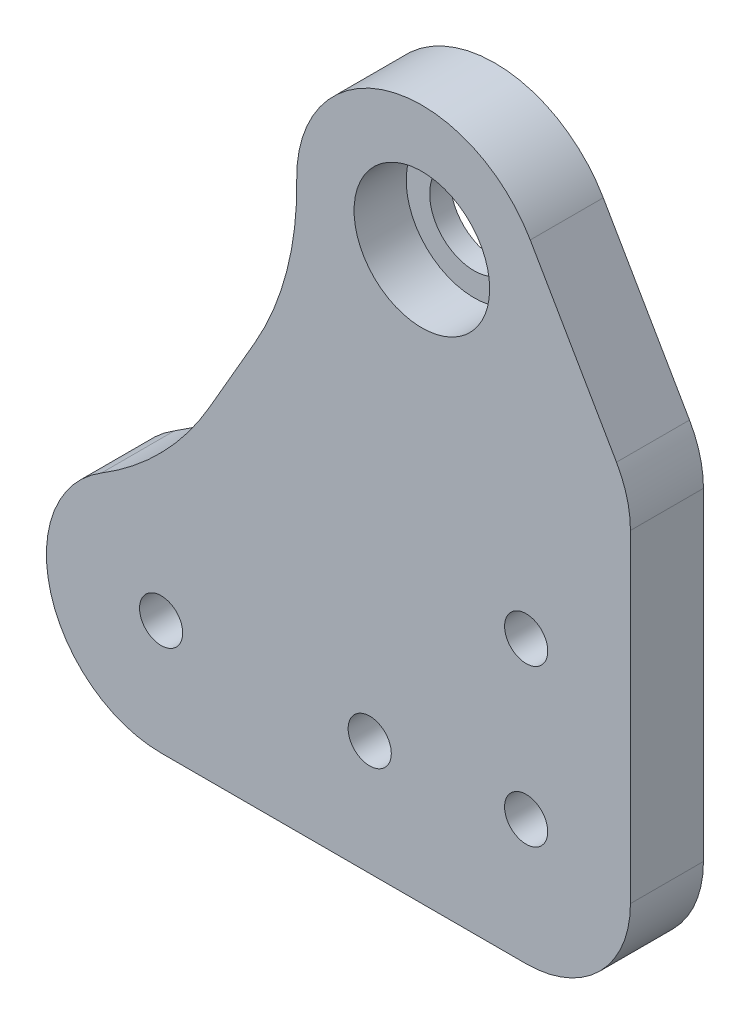
ISO-10303-21;
HEADER;
FILE_DESCRIPTION(('STEP AP214'),'2;1');
FILE_NAME('part.step','',(''),(''),'','','');
FILE_SCHEMA(('AUTOMOTIVE_DESIGN { 1 0 10303 214 1 1 1 1 }'));
ENDSEC;
DATA;
#1=APPLICATION_CONTEXT('core data for automotive mechanical design processes');
#2=APPLICATION_PROTOCOL_DEFINITION('international standard','automotive_design',2000,#1);
#3=PRODUCT_CONTEXT('',#1,'mechanical');
#4=PRODUCT('Part','Part','',(#3));
#5=PRODUCT_RELATED_PRODUCT_CATEGORY('part','',(#4));
#6=PRODUCT_DEFINITION_FORMATION('','',#4);
#7=PRODUCT_DEFINITION_CONTEXT('part definition',#1,'design');
#8=PRODUCT_DEFINITION('design','',#6,#7);
#9=PRODUCT_DEFINITION_SHAPE('','',#8);
#10=(LENGTH_UNIT() NAMED_UNIT(*) SI_UNIT(.MILLI.,.METRE.));
#11=(NAMED_UNIT(*) PLANE_ANGLE_UNIT() SI_UNIT($,.RADIAN.));
#12=(NAMED_UNIT(*) SI_UNIT($,.STERADIAN.) SOLID_ANGLE_UNIT());
#13=UNCERTAINTY_MEASURE_WITH_UNIT(LENGTH_MEASURE(1.E-05),#10,'distance_accuracy_value','');
#14=(GEOMETRIC_REPRESENTATION_CONTEXT(3) GLOBAL_UNCERTAINTY_ASSIGNED_CONTEXT((#13)) GLOBAL_UNIT_ASSIGNED_CONTEXT((#10,
#11,#12)) REPRESENTATION_CONTEXT('',''));
#15=CARTESIAN_POINT('',(0.,0.,0.));
#16=DIRECTION('',(0.,0.,1.));
#17=DIRECTION('',(1.,0.,0.));
#18=AXIS2_PLACEMENT_3D('',#15,#16,#17);
#19=CARTESIAN_POINT('',(25.000000000011,43.3012701892403,7.));
#20=DIRECTION('',(0.,0.,-1.));
#21=DIRECTION('',(-1.,0.,0.));
#22=AXIS2_PLACEMENT_3D('',#19,#20,#21);
#23=CYLINDRICAL_SURFACE('',#22,4.25000000000053);
#24=CARTESIAN_POINT('',(25.000000000011,43.3012701892403,0.));
#25=DIRECTION('',(0.,0.,1.));
#26=DIRECTION('',(1.,0.,0.));
#27=AXIS2_PLACEMENT_3D('',#24,#25,#26);
#28=CIRCLE('',#27,4.25000000000053);
#29=CARTESIAN_POINT('',(29.2500000000115,43.3012701892403,0.));
#30=VERTEX_POINT('',#29);
#31=EDGE_CURVE('E196',#30,#30,#28,.T.);
#32=ORIENTED_EDGE('',*,*,#31,.F.);
#33=EDGE_LOOP('',(#32));
#34=FACE_BOUND('',#33,.T.);
#35=CARTESIAN_POINT('',(25.000000000011,43.3012701892403,2.));
#36=DIRECTION('',(0.,0.,1.));
#37=DIRECTION('',(1.,0.,0.));
#38=AXIS2_PLACEMENT_3D('',#35,#36,#37);
#39=CIRCLE('',#38,4.25000000000053);
#40=CARTESIAN_POINT('',(29.2500000000115,43.3012701892403,2.));
#41=VERTEX_POINT('',#40);
#42=EDGE_CURVE('E38',#41,#41,#39,.T.);
#43=ORIENTED_EDGE('',*,*,#42,.T.);
#44=EDGE_LOOP('',(#43));
#45=FACE_BOUND('',#44,.T.);
#46=ADVANCED_FACE('F34',(#34,#45),#23,.F.);
#47=CARTESIAN_POINT('',(45.0000000000006,0.,7.));
#48=DIRECTION('',(1.,0.,0.));
#49=DIRECTION('',(0.,0.,-1.));
#50=AXIS2_PLACEMENT_3D('',#47,#48,#49);
#51=PLANE('',#50);
#52=DIRECTION('',(0.,-1.,0.));
#53=VECTOR('',#52,1.);
#54=CARTESIAN_POINT('',(45.0000000000006,0.,0.));
#55=LINE('',#54,#53);
#56=CARTESIAN_POINT('',(45.0000000000006,29.9807621135728,0.));
#57=VERTEX_POINT('',#56);
#58=CARTESIAN_POINT('',(45.0000000000006,-1.00000000000033,0.));
#59=VERTEX_POINT('',#58);
#60=EDGE_CURVE('E168',#57,#59,#55,.T.);
#61=ORIENTED_EDGE('',*,*,#60,.F.);
#62=DIRECTION('',(0.,0.,-1.));
#63=VECTOR('',#62,1.);
#64=CARTESIAN_POINT('',(45.0000000000006,29.9807621135728,7.));
#65=LINE('',#64,#63);
#66=CARTESIAN_POINT('',(45.0000000000006,29.9807621135728,7.));
#67=VERTEX_POINT('',#66);
#68=EDGE_CURVE('E11',#67,#57,#65,.T.);
#69=ORIENTED_EDGE('',*,*,#68,.F.);
#70=DIRECTION('',(0.,-1.,0.));
#71=VECTOR('',#70,1.);
#72=CARTESIAN_POINT('',(45.0000000000006,0.,7.));
#73=LINE('',#72,#71);
#74=CARTESIAN_POINT('',(45.0000000000006,-1.00000000000033,7.));
#75=VERTEX_POINT('',#74);
#76=EDGE_CURVE('E251',#67,#75,#73,.T.);
#77=ORIENTED_EDGE('',*,*,#76,.T.);
#78=DIRECTION('',(0.,0.,-1.));
#79=VECTOR('',#78,1.);
#80=CARTESIAN_POINT('',(45.0000000000006,-1.00000000000033,7.));
#81=LINE('',#80,#79);
#82=EDGE_CURVE('E92',#75,#59,#81,.T.);
#83=ORIENTED_EDGE('',*,*,#82,.T.);
#84=EDGE_LOOP('',(#61,#69,#77,#83));
#85=FACE_BOUND('',#84,.T.);
#86=ADVANCED_FACE('F221',(#85),#51,.T.);
#87=CARTESIAN_POINT('',(34.9999999999986,29.9807621135728,7.));
#88=DIRECTION('',(0.,0.,-1.));
#89=DIRECTION('',(-1.,0.,0.));
#90=AXIS2_PLACEMENT_3D('',#87,#88,#89);
#91=CYLINDRICAL_SURFACE('',#90,10.0000000000019);
#92=CARTESIAN_POINT('',(34.9999999999986,29.9807621135728,0.));
#93=DIRECTION('',(0.,0.,1.));
#94=DIRECTION('',(1.,0.,0.));
#95=AXIS2_PLACEMENT_3D('',#92,#93,#94);
#96=CIRCLE('',#95,10.0000000000019);
#97=CARTESIAN_POINT('',(43.6602540378446,34.9807621135736,0.));
#98=VERTEX_POINT('',#97);
#99=EDGE_CURVE('E166',#57,#98,#96,.T.);
#100=ORIENTED_EDGE('',*,*,#99,.T.);
#101=DIRECTION('',(0.,0.,-1.));
#102=VECTOR('',#101,1.);
#103=CARTESIAN_POINT('',(43.6602540378446,34.9807621135736,7.));
#104=LINE('',#103,#102);
#105=CARTESIAN_POINT('',(43.6602540378446,34.9807621135736,7.));
#106=VERTEX_POINT('',#105);
#107=EDGE_CURVE('E44',#106,#98,#104,.T.);
#108=ORIENTED_EDGE('',*,*,#107,.F.);
#109=CARTESIAN_POINT('',(34.9999999999986,29.9807621135728,7.));
#110=DIRECTION('',(0.,0.,1.));
#111=DIRECTION('',(1.,0.,0.));
#112=AXIS2_PLACEMENT_3D('',#109,#110,#111);
#113=CIRCLE('',#112,10.0000000000019);
#114=EDGE_CURVE('E253',#67,#106,#113,.T.);
#115=ORIENTED_EDGE('',*,*,#114,.F.);
#116=ORIENTED_EDGE('',*,*,#68,.T.);
#117=EDGE_LOOP('',(#100,#108,#115,#116));
#118=FACE_BOUND('',#117,.T.);
#119=ADVANCED_FACE('F167',(#118),#91,.T.);
#120=CARTESIAN_POINT('',(47.8923048454286,27.650635094627,7.));
#121=DIRECTION('',(-0.866025403784382,-0.500000000000097,0.));
#122=DIRECTION('',(0.500000000000097,-0.866025403784383,0.));
#123=AXIS2_PLACEMENT_3D('',#120,#121,#122);
#124=PLANE('',#123);
#125=DIRECTION('',(-0.500000000000097,0.866025403784382,0.));
#126=VECTOR('',#125,1.);
#127=CARTESIAN_POINT('',(47.8923048454286,27.650635094627,0.));
#128=LINE('',#127,#126);
#129=CARTESIAN_POINT('',(35.3923048454239,49.3012701892406,0.));
#130=VERTEX_POINT('',#129);
#131=EDGE_CURVE('E160',#98,#130,#128,.T.);
#132=ORIENTED_EDGE('',*,*,#131,.T.);
#133=DIRECTION('',(0.,0.,-1.));
#134=VECTOR('',#133,1.);
#135=CARTESIAN_POINT('',(35.3923048454239,49.3012701892406,7.));
#136=LINE('',#135,#134);
#137=CARTESIAN_POINT('',(35.3923048454239,49.3012701892406,7.));
#138=VERTEX_POINT('',#137);
#139=EDGE_CURVE('E150',#138,#130,#136,.T.);
#140=ORIENTED_EDGE('',*,*,#139,.F.);
#141=DIRECTION('',(-0.500000000000097,0.866025403784382,0.));
#142=VECTOR('',#141,1.);
#143=CARTESIAN_POINT('',(47.8923048454286,27.650635094627,7.));
#144=LINE('',#143,#142);
#145=EDGE_CURVE('E162',#106,#138,#144,.T.);
#146=ORIENTED_EDGE('',*,*,#145,.F.);
#147=ORIENTED_EDGE('',*,*,#107,.T.);
#148=EDGE_LOOP('',(#132,#140,#146,#147));
#149=FACE_BOUND('',#148,.T.);
#150=ADVANCED_FACE('F158',(#149),#124,.F.);
#151=CARTESIAN_POINT('',(25.000000000011,43.3012701892403,7.));
#152=DIRECTION('',(0.,0.,-1.));
#153=DIRECTION('',(-1.,0.,0.));
#154=AXIS2_PLACEMENT_3D('',#151,#152,#153);
#155=CYLINDRICAL_SURFACE('',#154,11.9999999999999);
#156=CARTESIAN_POINT('',(25.000000000011,43.3012701892403,0.));
#157=DIRECTION('',(0.,0.,1.));
#158=DIRECTION('',(1.,0.,0.));
#159=AXIS2_PLACEMENT_3D('',#156,#157,#158);
#160=CIRCLE('',#159,11.9999999999999);
#161=CARTESIAN_POINT('',(13.0018376106876,43.0912719049008,0.));
#162=VERTEX_POINT('',#161);
#163=EDGE_CURVE('E170',#130,#162,#160,.T.);
#164=ORIENTED_EDGE('',*,*,#163,.T.);
#165=DIRECTION('',(0.,0.,-1.));
#166=VECTOR('',#165,1.);
#167=CARTESIAN_POINT('',(13.0018376106876,43.0912719049008,7.));
#168=LINE('',#167,#166);
#169=CARTESIAN_POINT('',(13.0018376106876,43.0912719049008,7.));
#170=VERTEX_POINT('',#169);
#171=EDGE_CURVE('E148',#170,#162,#168,.T.);
#172=ORIENTED_EDGE('',*,*,#171,.F.);
#173=CARTESIAN_POINT('',(25.000000000011,43.3012701892403,7.));
#174=DIRECTION('',(0.,0.,1.));
#175=DIRECTION('',(1.,0.,0.));
#176=AXIS2_PLACEMENT_3D('',#173,#174,#175);
#177=CIRCLE('',#176,11.9999999999999);
#178=EDGE_CURVE('E256',#138,#170,#177,.T.);
#179=ORIENTED_EDGE('',*,*,#178,.F.);
#180=ORIENTED_EDGE('',*,*,#139,.T.);
#181=EDGE_LOOP('',(#164,#172,#179,#180));
#182=FACE_BOUND('',#181,.T.);
#183=ADVANCED_FACE('F276',(#182),#155,.T.);
#184=CARTESIAN_POINT('',(-16.993568362625,42.5662761940448,7.));
#185=DIRECTION('',(0.,0.,-1.));
#186=DIRECTION('',(-1.,0.,0.));
#187=AXIS2_PLACEMENT_3D('',#184,#185,#186);
#188=CYLINDRICAL_SURFACE('',#187,30.0000000000039);
#189=CARTESIAN_POINT('',(-16.993568362625,42.5662761940448,0.));
#190=DIRECTION('',(0.,0.,1.));
#191=DIRECTION('',(1.,0.,0.));
#192=AXIS2_PLACEMENT_3D('',#189,#190,#191);
#193=CIRCLE('',#192,30.0000000000039);
#194=CARTESIAN_POINT('',(8.98719375091206,27.5662761940443,0.));
#195=VERTEX_POINT('',#194);
#196=EDGE_CURVE('E178',#195,#162,#193,.T.);
#197=ORIENTED_EDGE('',*,*,#196,.F.);
#198=DIRECTION('',(0.,0.,-1.));
#199=VECTOR('',#198,1.);
#200=CARTESIAN_POINT('',(8.98719375091206,27.5662761940443,7.));
#201=LINE('',#200,#199);
#202=CARTESIAN_POINT('',(8.98719375091206,27.5662761940443,7.));
#203=VERTEX_POINT('',#202);
#204=EDGE_CURVE('E146',#203,#195,#201,.T.);
#205=ORIENTED_EDGE('',*,*,#204,.F.);
#206=CARTESIAN_POINT('',(-16.993568362625,42.5662761940448,7.));
#207=DIRECTION('',(0.,0.,1.));
#208=DIRECTION('',(1.,0.,0.));
#209=AXIS2_PLACEMENT_3D('',#206,#207,#208);
#210=CIRCLE('',#209,30.0000000000039);
#211=EDGE_CURVE('E258',#203,#170,#210,.T.);
#212=ORIENTED_EDGE('',*,*,#211,.T.);
#213=ORIENTED_EDGE('',*,*,#171,.T.);
#214=EDGE_LOOP('',(#197,#205,#212,#213));
#215=FACE_BOUND('',#214,.T.);
#216=ADVANCED_FACE('F271',(#215),#188,.F.);
#217=CARTESIAN_POINT('',(-5.19615242270605,2.99999999999961,7.));
#218=DIRECTION('',(0.866025403784443,-0.499999999999993,0.));
#219=DIRECTION('',(0.499999999999993,0.866025403784443,0.));
#220=AXIS2_PLACEMENT_3D('',#217,#218,#219);
#221=PLANE('',#220);
#222=DIRECTION('',(-0.499999999999993,-0.866025403784443,0.));
#223=VECTOR('',#222,1.);
#224=CARTESIAN_POINT('',(-5.19615242270605,2.99999999999961,0.));
#225=LINE('',#224,#223);
#226=CARTESIAN_POINT('',(4.6145560124693,19.9926454679682,0.));
#227=VERTEX_POINT('',#226);
#228=EDGE_CURVE('E181',#195,#227,#225,.T.);
#229=ORIENTED_EDGE('',*,*,#228,.T.);
#230=DIRECTION('',(0.,0.,-1.));
#231=VECTOR('',#230,1.);
#232=CARTESIAN_POINT('',(4.6145560124693,19.9926454679682,7.));
#233=LINE('',#232,#231);
#234=CARTESIAN_POINT('',(4.6145560124693,19.9926454679682,7.));
#235=VERTEX_POINT('',#234);
#236=EDGE_CURVE('E140',#235,#227,#233,.T.);
#237=ORIENTED_EDGE('',*,*,#236,.F.);
#238=DIRECTION('',(-0.499999999999993,-0.866025403784443,0.));
#239=VECTOR('',#238,1.);
#240=CARTESIAN_POINT('',(-5.19615242270605,2.99999999999961,7.));
#241=LINE('',#240,#239);
#242=EDGE_CURVE('E261',#203,#235,#241,.T.);
#243=ORIENTED_EDGE('',*,*,#242,.F.);
#244=ORIENTED_EDGE('',*,*,#204,.T.);
#245=EDGE_LOOP('',(#229,#237,#243,#244));
#246=FACE_BOUND('',#245,.T.);
#247=ADVANCED_FACE('F277',(#246),#221,.F.);
#248=CARTESIAN_POINT('',(-21.3662061010691,34.9926454679714,7.));
#249=DIRECTION('',(0.,0.,-1.));
#250=DIRECTION('',(-1.,0.,0.));
#251=AXIS2_PLACEMENT_3D('',#248,#249,#250);
#252=CYLINDRICAL_SURFACE('',#251,30.0000000000063);
#253=CARTESIAN_POINT('',(-21.3662061010691,34.9926454679714,0.));
#254=DIRECTION('',(0.,0.,1.));
#255=DIRECTION('',(1.,0.,0.));
#256=AXIS2_PLACEMENT_3D('',#253,#254,#255);
#257=CIRCLE('',#256,30.0000000000063);
#258=CARTESIAN_POINT('',(-5.7323967588222,9.38827073530809,0.));
#259=VERTEX_POINT('',#258);
#260=EDGE_CURVE('E184',#259,#227,#257,.T.);
#261=ORIENTED_EDGE('',*,*,#260,.F.);
#262=DIRECTION('',(0.,0.,-1.));
#263=VECTOR('',#262,1.);
#264=CARTESIAN_POINT('',(-5.7323967588222,9.38827073530809,7.));
#265=LINE('',#264,#263);
#266=CARTESIAN_POINT('',(-5.7323967588222,9.38827073530809,7.));
#267=VERTEX_POINT('',#266);
#268=EDGE_CURVE('E138',#267,#259,#265,.T.);
#269=ORIENTED_EDGE('',*,*,#268,.F.);
#270=CARTESIAN_POINT('',(-21.3662061010691,34.9926454679714,7.));
#271=DIRECTION('',(0.,0.,1.));
#272=DIRECTION('',(1.,0.,0.));
#273=AXIS2_PLACEMENT_3D('',#270,#271,#272);
#274=CIRCLE('',#273,30.0000000000063);
#275=EDGE_CURVE('E132',#267,#235,#274,.T.);
#276=ORIENTED_EDGE('',*,*,#275,.T.);
#277=ORIENTED_EDGE('',*,*,#236,.T.);
#278=EDGE_LOOP('',(#261,#269,#276,#277));
#279=FACE_BOUND('',#278,.T.);
#280=ADVANCED_FACE('F265',(#279),#252,.F.);
#281=CARTESIAN_POINT('',(0.,0.,7.));
#282=DIRECTION('',(0.,0.,-1.));
#283=DIRECTION('',(-1.,0.,0.));
#284=AXIS2_PLACEMENT_3D('',#281,#282,#283);
#285=CYLINDRICAL_SURFACE('',#284,10.9999999999999);
#286=CARTESIAN_POINT('',(0.,0.,0.));
#287=DIRECTION('',(0.,0.,1.));
#288=DIRECTION('',(1.,0.,0.));
#289=AXIS2_PLACEMENT_3D('',#286,#287,#288);
#290=CIRCLE('',#289,10.9999999999999);
#291=CARTESIAN_POINT('',(0.,-11.0000000000001,0.));
#292=VERTEX_POINT('',#291);
#293=EDGE_CURVE('E137',#259,#292,#290,.T.);
#294=ORIENTED_EDGE('',*,*,#293,.T.);
#295=DIRECTION('',(0.,0.,-1.));
#296=VECTOR('',#295,1.);
#297=CARTESIAN_POINT('',(0.,-11.0000000000001,7.));
#298=LINE('',#297,#296);
#299=CARTESIAN_POINT('',(0.,-11.0000000000001,7.));
#300=VERTEX_POINT('',#299);
#301=EDGE_CURVE('E123',#300,#292,#298,.T.);
#302=ORIENTED_EDGE('',*,*,#301,.F.);
#303=CARTESIAN_POINT('',(0.,0.,7.));
#304=DIRECTION('',(0.,0.,1.));
#305=DIRECTION('',(1.,0.,0.));
#306=AXIS2_PLACEMENT_3D('',#303,#304,#305);
#307=CIRCLE('',#306,10.9999999999999);
#308=EDGE_CURVE('E126',#267,#300,#307,.T.);
#309=ORIENTED_EDGE('',*,*,#308,.F.);
#310=ORIENTED_EDGE('',*,*,#268,.T.);
#311=EDGE_LOOP('',(#294,#302,#309,#310));
#312=FACE_BOUND('',#311,.T.);
#313=ADVANCED_FACE('F135',(#312),#285,.T.);
#314=CARTESIAN_POINT('',(0.,-11.0000000000001,7.));
#315=DIRECTION('',(0.,1.,0.));
#316=DIRECTION('',(0.,0.,1.));
#317=AXIS2_PLACEMENT_3D('',#314,#315,#316);
#318=PLANE('',#317);
#319=DIRECTION('',(1.,0.,0.));
#320=VECTOR('',#319,1.);
#321=CARTESIAN_POINT('',(0.,-11.0000000000001,0.));
#322=LINE('',#321,#320);
#323=CARTESIAN_POINT('',(35.0000000000001,-11.0000000000001,0.));
#324=VERTEX_POINT('',#323);
#325=EDGE_CURVE('E188',#292,#324,#322,.T.);
#326=ORIENTED_EDGE('',*,*,#325,.T.);
#327=DIRECTION('',(0.,0.,-1.));
#328=VECTOR('',#327,1.);
#329=CARTESIAN_POINT('',(35.0000000000001,-11.0000000000001,7.));
#330=LINE('',#329,#328);
#331=CARTESIAN_POINT('',(35.0000000000001,-11.0000000000001,7.));
#332=VERTEX_POINT('',#331);
#333=EDGE_CURVE('E125',#332,#324,#330,.T.);
#334=ORIENTED_EDGE('',*,*,#333,.F.);
#335=DIRECTION('',(1.,0.,0.));
#336=VECTOR('',#335,1.);
#337=CARTESIAN_POINT('',(0.,-11.0000000000001,7.));
#338=LINE('',#337,#336);
#339=EDGE_CURVE('E118',#300,#332,#338,.T.);
#340=ORIENTED_EDGE('',*,*,#339,.F.);
#341=ORIENTED_EDGE('',*,*,#301,.T.);
#342=EDGE_LOOP('',(#326,#334,#340,#341));
#343=FACE_BOUND('',#342,.T.);
#344=ADVANCED_FACE('F121',(#343),#318,.F.);
#345=CARTESIAN_POINT('',(35.0000000000001,16.,7.));
#346=DIRECTION('',(0.,0.,-1.));
#347=DIRECTION('',(-1.,0.,0.));
#348=AXIS2_PLACEMENT_3D('',#345,#346,#347);
#349=CYLINDRICAL_SURFACE('',#348,2.06999999999913);
#350=CARTESIAN_POINT('',(35.0000000000001,16.,7.));
#351=DIRECTION('',(0.,0.,1.));
#352=DIRECTION('',(1.,0.,0.));
#353=AXIS2_PLACEMENT_3D('',#350,#351,#352);
#354=CIRCLE('',#353,2.06999999999913);
#355=CARTESIAN_POINT('',(37.0699999999993,16.,7.));
#356=VERTEX_POINT('',#355);
#357=EDGE_CURVE('E249',#356,#356,#354,.T.);
#358=ORIENTED_EDGE('',*,*,#357,.T.);
#359=EDGE_LOOP('',(#358));
#360=FACE_BOUND('',#359,.T.);
#361=CARTESIAN_POINT('',(35.0000000000001,16.,0.));
#362=DIRECTION('',(0.,0.,1.));
#363=DIRECTION('',(1.,0.,0.));
#364=AXIS2_PLACEMENT_3D('',#361,#362,#363);
#365=CIRCLE('',#364,2.06999999999913);
#366=CARTESIAN_POINT('',(37.0699999999993,16.,0.));
#367=VERTEX_POINT('',#366);
#368=EDGE_CURVE('E172',#367,#367,#365,.T.);
#369=ORIENTED_EDGE('',*,*,#368,.F.);
#370=EDGE_LOOP('',(#369));
#371=FACE_BOUND('',#370,.T.);
#372=ADVANCED_FACE('F206',(#360,#371),#349,.F.);
#373=CARTESIAN_POINT('',(35.0000000000001,0.99999999999989,7.));
#374=DIRECTION('',(0.,0.,-1.));
#375=DIRECTION('',(-1.,0.,0.));
#376=AXIS2_PLACEMENT_3D('',#373,#374,#375);
#377=CYLINDRICAL_SURFACE('',#376,2.06999999999913);
#378=CARTESIAN_POINT('',(35.0000000000001,0.99999999999989,7.));
#379=DIRECTION('',(0.,0.,1.));
#380=DIRECTION('',(1.,0.,0.));
#381=AXIS2_PLACEMENT_3D('',#378,#379,#380);
#382=CIRCLE('',#381,2.06999999999913);
#383=CARTESIAN_POINT('',(37.0699999999993,0.99999999999989,7.));
#384=VERTEX_POINT('',#383);
#385=EDGE_CURVE('E246',#384,#384,#382,.T.);
#386=ORIENTED_EDGE('',*,*,#385,.T.);
#387=EDGE_LOOP('',(#386));
#388=FACE_BOUND('',#387,.T.);
#389=CARTESIAN_POINT('',(35.0000000000001,0.99999999999989,0.));
#390=DIRECTION('',(0.,0.,1.));
#391=DIRECTION('',(1.,0.,0.));
#392=AXIS2_PLACEMENT_3D('',#389,#390,#391);
#393=CIRCLE('',#392,2.06999999999913);
#394=CARTESIAN_POINT('',(37.0699999999993,0.99999999999989,0.));
#395=VERTEX_POINT('',#394);
#396=EDGE_CURVE('E199',#395,#395,#393,.T.);
#397=ORIENTED_EDGE('',*,*,#396,.F.);
#398=EDGE_LOOP('',(#397));
#399=FACE_BOUND('',#398,.T.);
#400=ADVANCED_FACE('F208',(#388,#399),#377,.F.);
#401=CARTESIAN_POINT('',(0.,0.,7.));
#402=DIRECTION('',(0.,0.,-1.));
#403=DIRECTION('',(-1.,0.,0.));
#404=AXIS2_PLACEMENT_3D('',#401,#402,#403);
#405=CYLINDRICAL_SURFACE('',#404,2.06999999999913);
#406=CARTESIAN_POINT('',(0.,0.,7.));
#407=DIRECTION('',(0.,0.,1.));
#408=DIRECTION('',(1.,0.,0.));
#409=AXIS2_PLACEMENT_3D('',#406,#407,#408);
#410=CIRCLE('',#409,2.06999999999913);
#411=CARTESIAN_POINT('',(2.06999999999913,0.,7.));
#412=VERTEX_POINT('',#411);
#413=EDGE_CURVE('E190',#412,#412,#410,.T.);
#414=ORIENTED_EDGE('',*,*,#413,.T.);
#415=EDGE_LOOP('',(#414));
#416=FACE_BOUND('',#415,.T.);
#417=CARTESIAN_POINT('',(0.,0.,0.));
#418=DIRECTION('',(0.,0.,1.));
#419=DIRECTION('',(1.,0.,0.));
#420=AXIS2_PLACEMENT_3D('',#417,#418,#419);
#421=CIRCLE('',#420,2.06999999999913);
#422=CARTESIAN_POINT('',(2.06999999999913,0.,0.));
#423=VERTEX_POINT('',#422);
#424=EDGE_CURVE('E193',#423,#423,#421,.T.);
#425=ORIENTED_EDGE('',*,*,#424,.F.);
#426=EDGE_LOOP('',(#425));
#427=FACE_BOUND('',#426,.T.);
#428=ADVANCED_FACE('F36',(#416,#427),#405,.F.);
#429=CARTESIAN_POINT('',(35.0000000000006,-1.00000000000033,7.));
#430=DIRECTION('',(0.,0.,-1.));
#431=DIRECTION('',(-1.,0.,0.));
#432=AXIS2_PLACEMENT_3D('',#429,#430,#431);
#433=CYLINDRICAL_SURFACE('',#432,9.9999999999999);
#434=CARTESIAN_POINT('',(35.0000000000006,-1.00000000000033,0.));
#435=DIRECTION('',(0.,0.,1.));
#436=DIRECTION('',(1.,0.,0.));
#437=AXIS2_PLACEMENT_3D('',#434,#435,#436);
#438=CIRCLE('',#437,9.9999999999999);
#439=EDGE_CURVE('E85',#324,#59,#438,.T.);
#440=ORIENTED_EDGE('',*,*,#439,.T.);
#441=ORIENTED_EDGE('',*,*,#82,.F.);
#442=CARTESIAN_POINT('',(35.0000000000006,-1.00000000000033,7.));
#443=DIRECTION('',(0.,0.,1.));
#444=DIRECTION('',(1.,0.,0.));
#445=AXIS2_PLACEMENT_3D('',#442,#443,#444);
#446=CIRCLE('',#445,9.9999999999999);
#447=EDGE_CURVE('E52',#332,#75,#446,.T.);
#448=ORIENTED_EDGE('',*,*,#447,.F.);
#449=ORIENTED_EDGE('',*,*,#333,.T.);
#450=EDGE_LOOP('',(#440,#441,#448,#449));
#451=FACE_BOUND('',#450,.T.);
#452=ADVANCED_FACE('F351',(#451),#433,.T.);
#453=CARTESIAN_POINT('',(0.,0.,7.));
#454=DIRECTION('',(0.,0.,1.));
#455=DIRECTION('',(1.,0.,0.));
#456=AXIS2_PLACEMENT_3D('',#453,#454,#455);
#457=PLANE('',#456);
#458=CARTESIAN_POINT('',(20.,0.,7.));
#459=DIRECTION('',(0.,0.,1.));
#460=DIRECTION('',(1.,0.,0.));
#461=AXIS2_PLACEMENT_3D('',#458,#459,#460);
#462=CIRCLE('',#461,2.06999999999913);
#463=CARTESIAN_POINT('',(22.0699999999991,0.,7.));
#464=VERTEX_POINT('',#463);
#465=EDGE_CURVE('E241',#464,#464,#462,.T.);
#466=ORIENTED_EDGE('',*,*,#465,.F.);
#467=EDGE_LOOP('',(#466));
#468=FACE_BOUND('',#467,.T.);
#469=CARTESIAN_POINT('',(25.000000000011,43.3012701892403,7.));
#470=DIRECTION('',(0.,0.,1.));
#471=DIRECTION('',(1.,0.,0.));
#472=AXIS2_PLACEMENT_3D('',#469,#470,#471);
#473=CIRCLE('',#472,6.5);
#474=CARTESIAN_POINT('',(31.500000000011,43.3012701892403,7.));
#475=VERTEX_POINT('',#474);
#476=EDGE_CURVE('E233',#475,#475,#473,.T.);
#477=ORIENTED_EDGE('',*,*,#476,.F.);
#478=EDGE_LOOP('',(#477));
#479=FACE_BOUND('',#478,.T.);
#480=ORIENTED_EDGE('',*,*,#413,.F.);
#481=EDGE_LOOP('',(#480));
#482=FACE_BOUND('',#481,.T.);
#483=ORIENTED_EDGE('',*,*,#385,.F.);
#484=EDGE_LOOP('',(#483));
#485=FACE_BOUND('',#484,.T.);
#486=ORIENTED_EDGE('',*,*,#357,.F.);
#487=EDGE_LOOP('',(#486));
#488=FACE_BOUND('',#487,.T.);
#489=ORIENTED_EDGE('',*,*,#76,.F.);
#490=ORIENTED_EDGE('',*,*,#114,.T.);
#491=ORIENTED_EDGE('',*,*,#145,.T.);
#492=ORIENTED_EDGE('',*,*,#178,.T.);
#493=ORIENTED_EDGE('',*,*,#211,.F.);
#494=ORIENTED_EDGE('',*,*,#242,.T.);
#495=ORIENTED_EDGE('',*,*,#275,.F.);
#496=ORIENTED_EDGE('',*,*,#308,.T.);
#497=ORIENTED_EDGE('',*,*,#339,.T.);
#498=ORIENTED_EDGE('',*,*,#447,.T.);
#499=EDGE_LOOP('',(#489,#490,#491,#492,#493,#494,#495,#496,#497,#498));
#500=FACE_BOUND('',#499,.T.);
#501=ADVANCED_FACE('F130',(#468,#479,#482,#485,#488,#500),#457,.T.);
#502=CARTESIAN_POINT('',(0.,0.,0.));
#503=DIRECTION('',(0.,0.,1.));
#504=DIRECTION('',(1.,0.,0.));
#505=AXIS2_PLACEMENT_3D('',#502,#503,#504);
#506=PLANE('',#505);
#507=CARTESIAN_POINT('',(20.,0.,0.));
#508=DIRECTION('',(0.,0.,1.));
#509=DIRECTION('',(1.,0.,0.));
#510=AXIS2_PLACEMENT_3D('',#507,#508,#509);
#511=CIRCLE('',#510,2.06999999999913);
#512=CARTESIAN_POINT('',(22.0699999999991,0.,0.));
#513=VERTEX_POINT('',#512);
#514=EDGE_CURVE('E238',#513,#513,#511,.T.);
#515=ORIENTED_EDGE('',*,*,#514,.T.);
#516=EDGE_LOOP('',(#515));
#517=FACE_BOUND('',#516,.T.);
#518=ORIENTED_EDGE('',*,*,#424,.T.);
#519=EDGE_LOOP('',(#518));
#520=FACE_BOUND('',#519,.T.);
#521=ORIENTED_EDGE('',*,*,#31,.T.);
#522=EDGE_LOOP('',(#521));
#523=FACE_BOUND('',#522,.T.);
#524=ORIENTED_EDGE('',*,*,#396,.T.);
#525=EDGE_LOOP('',(#524));
#526=FACE_BOUND('',#525,.T.);
#527=ORIENTED_EDGE('',*,*,#368,.T.);
#528=EDGE_LOOP('',(#527));
#529=FACE_BOUND('',#528,.T.);
#530=ORIENTED_EDGE('',*,*,#60,.T.);
#531=ORIENTED_EDGE('',*,*,#439,.F.);
#532=ORIENTED_EDGE('',*,*,#325,.F.);
#533=ORIENTED_EDGE('',*,*,#293,.F.);
#534=ORIENTED_EDGE('',*,*,#260,.T.);
#535=ORIENTED_EDGE('',*,*,#228,.F.);
#536=ORIENTED_EDGE('',*,*,#196,.T.);
#537=ORIENTED_EDGE('',*,*,#163,.F.);
#538=ORIENTED_EDGE('',*,*,#131,.F.);
#539=ORIENTED_EDGE('',*,*,#99,.F.);
#540=EDGE_LOOP('',(#530,#531,#532,#533,#534,#535,#536,#537,#538,#539));
#541=FACE_BOUND('',#540,.T.);
#542=ADVANCED_FACE('F204',(#517,#520,#523,#526,#529,#541),#506,.F.);
#543=CARTESIAN_POINT('',(25.000000000011,43.3012701892403,2.));
#544=DIRECTION('',(0.,0.,1.));
#545=DIRECTION('',(1.,0.,0.));
#546=AXIS2_PLACEMENT_3D('',#543,#544,#545);
#547=CYLINDRICAL_SURFACE('',#546,6.5);
#548=CARTESIAN_POINT('',(25.000000000011,43.3012701892403,2.));
#549=DIRECTION('',(0.,0.,1.));
#550=DIRECTION('',(1.,0.,0.));
#551=AXIS2_PLACEMENT_3D('',#548,#549,#550);
#552=CIRCLE('',#551,6.5);
#553=CARTESIAN_POINT('',(31.500000000011,43.3012701892403,2.));
#554=VERTEX_POINT('',#553);
#555=EDGE_CURVE('E231',#554,#554,#552,.T.);
#556=ORIENTED_EDGE('',*,*,#555,.F.);
#557=EDGE_LOOP('',(#556));
#558=FACE_BOUND('',#557,.T.);
#559=ORIENTED_EDGE('',*,*,#476,.T.);
#560=EDGE_LOOP('',(#559));
#561=FACE_BOUND('',#560,.T.);
#562=ADVANCED_FACE('F373',(#558,#561),#547,.F.);
#563=CARTESIAN_POINT('',(25.000000000011,43.3012701892403,2.));
#564=DIRECTION('',(0.,0.,1.));
#565=DIRECTION('',(1.,0.,0.));
#566=AXIS2_PLACEMENT_3D('',#563,#564,#565);
#567=PLANE('',#566);
#568=ORIENTED_EDGE('',*,*,#42,.F.);
#569=EDGE_LOOP('',(#568));
#570=FACE_BOUND('',#569,.T.);
#571=ORIENTED_EDGE('',*,*,#555,.T.);
#572=EDGE_LOOP('',(#571));
#573=FACE_BOUND('',#572,.T.);
#574=ADVANCED_FACE('F377',(#570,#573),#567,.T.);
#575=CARTESIAN_POINT('',(20.,0.,0.));
#576=DIRECTION('',(0.,0.,1.));
#577=DIRECTION('',(1.,0.,0.));
#578=AXIS2_PLACEMENT_3D('',#575,#576,#577);
#579=CYLINDRICAL_SURFACE('',#578,2.06999999999913);
#580=ORIENTED_EDGE('',*,*,#514,.F.);
#581=EDGE_LOOP('',(#580));
#582=FACE_BOUND('',#581,.T.);
#583=ORIENTED_EDGE('',*,*,#465,.T.);
#584=EDGE_LOOP('',(#583));
#585=FACE_BOUND('',#584,.T.);
#586=ADVANCED_FACE('F388',(#582,#585),#579,.F.);
#587=CLOSED_SHELL('',(#46,#86,#119,#150,#183,#216,#247,#280,#313,#344,#372,#400,#428,#452,#501,
#542,#562,#574,#586));
#588=MANIFOLD_SOLID_BREP('B2',#587);
#589=ADVANCED_BREP_SHAPE_REPRESENTATION('',(#18,#588),#14);
#590=SHAPE_DEFINITION_REPRESENTATION(#9,#589);
ENDSEC;
END-ISO-10303-21;
